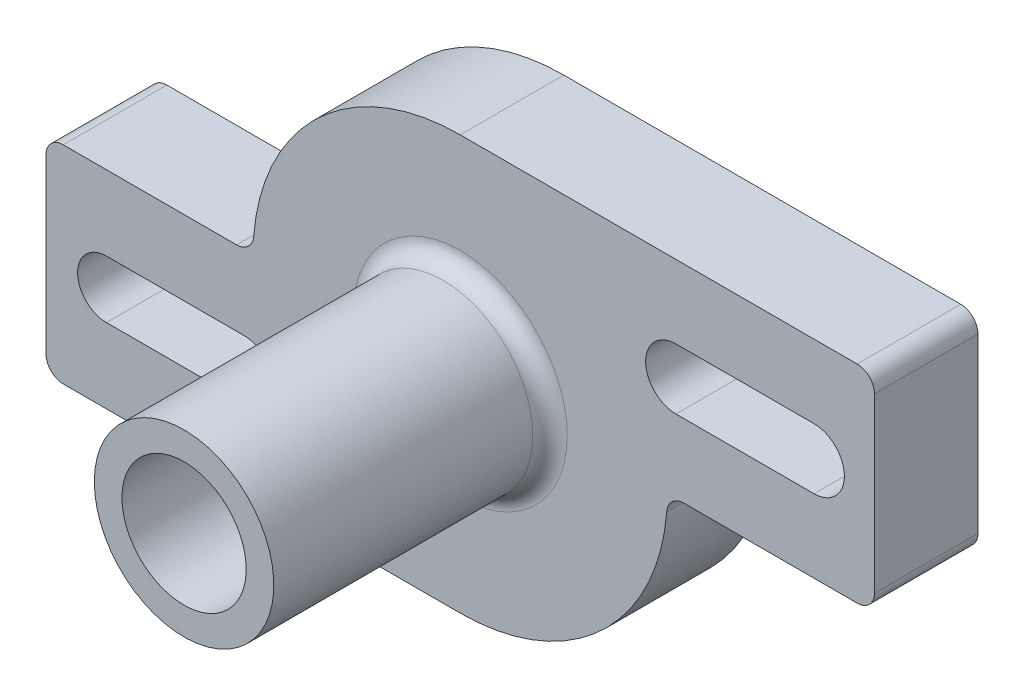
ISO-10303-21;
HEADER;
FILE_DESCRIPTION(('STEP AP214'),'2;1');
FILE_NAME('part.step','',(''),(''),'','','');
FILE_SCHEMA(('AUTOMOTIVE_DESIGN { 1 0 10303 214 1 1 1 1 }'));
ENDSEC;
DATA;
#1=APPLICATION_CONTEXT('core data for automotive mechanical design processes');
#2=APPLICATION_PROTOCOL_DEFINITION('international standard','automotive_design',2000,#1);
#3=PRODUCT_CONTEXT('',#1,'mechanical');
#4=PRODUCT('Part','Part','',(#3));
#5=PRODUCT_RELATED_PRODUCT_CATEGORY('part','',(#4));
#6=PRODUCT_DEFINITION_FORMATION('','',#4);
#7=PRODUCT_DEFINITION_CONTEXT('part definition',#1,'design');
#8=PRODUCT_DEFINITION('design','',#6,#7);
#9=PRODUCT_DEFINITION_SHAPE('','',#8);
#10=(LENGTH_UNIT() NAMED_UNIT(*) SI_UNIT(.MILLI.,.METRE.));
#11=(NAMED_UNIT(*) PLANE_ANGLE_UNIT() SI_UNIT($,.RADIAN.));
#12=(NAMED_UNIT(*) SI_UNIT($,.STERADIAN.) SOLID_ANGLE_UNIT());
#13=UNCERTAINTY_MEASURE_WITH_UNIT(LENGTH_MEASURE(1.E-05),#10,'distance_accuracy_value','');
#14=(GEOMETRIC_REPRESENTATION_CONTEXT(3) GLOBAL_UNCERTAINTY_ASSIGNED_CONTEXT((#13)) GLOBAL_UNIT_ASSIGNED_CONTEXT((#10,
#11,#12)) REPRESENTATION_CONTEXT('',''));
#15=CARTESIAN_POINT('',(0.,0.,0.));
#16=DIRECTION('',(0.,0.,1.));
#17=DIRECTION('',(1.,0.,0.));
#18=AXIS2_PLACEMENT_3D('',#15,#16,#17);
#19=CARTESIAN_POINT('',(-47.7897984071504,88.3956534963122,3.));
#20=DIRECTION('',(0.,0.,1.));
#21=DIRECTION('',(1.,0.,0.));
#22=AXIS2_PLACEMENT_3D('',#19,#20,#21);
#23=PLANE('',#22);
#24=CARTESIAN_POINT('',(-47.7897984071504,88.3956534963122,3.));
#25=DIRECTION('',(0.,0.,1.));
#26=DIRECTION('',(1.,0.,0.));
#27=AXIS2_PLACEMENT_3D('',#24,#25,#26);
#28=CIRCLE('',#27,3.1);
#29=CARTESIAN_POINT('',(-44.6897984071504,88.3956534963122,3.));
#30=VERTEX_POINT('',#29);
#31=EDGE_CURVE('E317',#30,#30,#28,.F.);
#32=ORIENTED_EDGE('',*,*,#31,.T.);
#33=EDGE_LOOP('',(#32));
#34=FACE_BOUND('',#33,.T.);
#35=DIRECTION('',(0.,-1.,0.));
#36=VECTOR('',#35,1.);
#37=CARTESIAN_POINT('',(-59.7897984071504,88.3956534963122,3.));
#38=LINE('',#37,#36);
#39=CARTESIAN_POINT('',(-59.7897984071504,87.8956534963122,3.));
#40=VERTEX_POINT('',#39);
#41=CARTESIAN_POINT('',(-59.7897984071504,82.8956534963122,3.));
#42=VERTEX_POINT('',#41);
#43=EDGE_CURVE('E265',#40,#42,#38,.T.);
#44=ORIENTED_EDGE('',*,*,#43,.T.);
#45=CARTESIAN_POINT('',(-59.2897984071504,82.8956534963122,3.));
#46=DIRECTION('',(0.,0.,1.));
#47=DIRECTION('',(1.,0.,0.));
#48=AXIS2_PLACEMENT_3D('',#45,#46,#47);
#49=CIRCLE('',#48,0.5);
#50=CARTESIAN_POINT('',(-59.2897984071504,82.3956534963122,3.));
#51=VERTEX_POINT('',#50);
#52=EDGE_CURVE('E315',#42,#51,#49,.T.);
#53=ORIENTED_EDGE('',*,*,#52,.T.);
#54=DIRECTION('',(1.,0.,0.));
#55=VECTOR('',#54,1.);
#56=CARTESIAN_POINT('',(-59.7897984071504,82.3956534963122,3.));
#57=LINE('',#56,#55);
#58=CARTESIAN_POINT('',(-47.7897984071504,82.3956534963122,3.));
#59=VERTEX_POINT('',#58);
#60=EDGE_CURVE('E268',#51,#59,#57,.T.);
#61=ORIENTED_EDGE('',*,*,#60,.T.);
#62=CARTESIAN_POINT('',(-47.7897984071504,88.3956534963122,3.));
#63=DIRECTION('',(0.,0.,1.));
#64=DIRECTION('',(1.,0.,0.));
#65=AXIS2_PLACEMENT_3D('',#62,#63,#64);
#66=CIRCLE('',#65,6.);
#67=CARTESIAN_POINT('',(-41.8075762240047,87.9341150347738,3.));
#68=VERTEX_POINT('',#67);
#69=EDGE_CURVE('E270',#59,#68,#66,.T.);
#70=ORIENTED_EDGE('',*,*,#69,.T.);
#71=CARTESIAN_POINT('',(-41.3090577087425,87.8956534963122,3.));
#72=DIRECTION('',(0.,0.,1.));
#73=DIRECTION('',(1.,0.,0.));
#74=AXIS2_PLACEMENT_3D('',#71,#72,#73);
#75=CIRCLE('',#74,0.5);
#76=CARTESIAN_POINT('',(-41.3090577087425,88.3956534963122,3.));
#77=VERTEX_POINT('',#76);
#78=EDGE_CURVE('E11',#68,#77,#75,.F.);
#79=ORIENTED_EDGE('',*,*,#78,.T.);
#80=DIRECTION('',(1.,0.,0.));
#81=VECTOR('',#80,1.);
#82=CARTESIAN_POINT('',(-41.7897984071504,88.3956534963122,3.));
#83=LINE('',#82,#81);
#84=CARTESIAN_POINT('',(-36.2897984071504,88.3956534963122,3.));
#85=VERTEX_POINT('',#84);
#86=EDGE_CURVE('E273',#77,#85,#83,.T.);
#87=ORIENTED_EDGE('',*,*,#86,.T.);
#88=CARTESIAN_POINT('',(-36.2897984071504,88.8956534963122,3.));
#89=DIRECTION('',(0.,0.,1.));
#90=DIRECTION('',(1.,0.,0.));
#91=AXIS2_PLACEMENT_3D('',#88,#89,#90);
#92=CIRCLE('',#91,0.5);
#93=CARTESIAN_POINT('',(-35.7897984071504,88.8956534963122,3.));
#94=VERTEX_POINT('',#93);
#95=EDGE_CURVE('E311',#85,#94,#92,.T.);
#96=ORIENTED_EDGE('',*,*,#95,.T.);
#97=DIRECTION('',(0.,1.,0.));
#98=VECTOR('',#97,1.);
#99=CARTESIAN_POINT('',(-35.7897984071504,94.3956534963122,3.));
#100=LINE('',#99,#98);
#101=CARTESIAN_POINT('',(-35.7897984071504,93.8956534963122,3.));
#102=VERTEX_POINT('',#101);
#103=EDGE_CURVE('E276',#94,#102,#100,.T.);
#104=ORIENTED_EDGE('',*,*,#103,.T.);
#105=CARTESIAN_POINT('',(-36.2897984071504,93.8956534963122,3.));
#106=DIRECTION('',(0.,0.,1.));
#107=DIRECTION('',(1.,0.,0.));
#108=AXIS2_PLACEMENT_3D('',#105,#106,#107);
#109=CIRCLE('',#108,0.5);
#110=CARTESIAN_POINT('',(-36.2897984071504,94.3956534963122,3.));
#111=VERTEX_POINT('',#110);
#112=EDGE_CURVE('E309',#102,#111,#109,.T.);
#113=ORIENTED_EDGE('',*,*,#112,.T.);
#114=DIRECTION('',(-1.,0.,0.));
#115=VECTOR('',#114,1.);
#116=CARTESIAN_POINT('',(-47.7897984071504,94.3956534963122,3.));
#117=LINE('',#116,#115);
#118=CARTESIAN_POINT('',(-47.7897984071504,94.3956534963122,3.));
#119=VERTEX_POINT('',#118);
#120=EDGE_CURVE('E279',#111,#119,#117,.T.);
#121=ORIENTED_EDGE('',*,*,#120,.T.);
#122=CARTESIAN_POINT('',(-47.7897984071504,88.3956534963122,3.));
#123=DIRECTION('',(0.,0.,1.));
#124=DIRECTION('',(1.,0.,0.));
#125=AXIS2_PLACEMENT_3D('',#122,#123,#124);
#126=CIRCLE('',#125,6.);
#127=CARTESIAN_POINT('',(-53.7720205902961,88.8571919578507,3.));
#128=VERTEX_POINT('',#127);
#129=EDGE_CURVE('E258',#119,#128,#126,.T.);
#130=ORIENTED_EDGE('',*,*,#129,.T.);
#131=CARTESIAN_POINT('',(-54.2705391055582,88.8956534963122,3.));
#132=DIRECTION('',(0.,0.,1.));
#133=DIRECTION('',(1.,0.,0.));
#134=AXIS2_PLACEMENT_3D('',#131,#132,#133);
#135=CIRCLE('',#134,0.5);
#136=CARTESIAN_POINT('',(-54.2705391055582,88.3956534963122,3.));
#137=VERTEX_POINT('',#136);
#138=EDGE_CURVE('E357',#128,#137,#135,.F.);
#139=ORIENTED_EDGE('',*,*,#138,.T.);
#140=DIRECTION('',(-1.,0.,0.));
#141=VECTOR('',#140,1.);
#142=CARTESIAN_POINT('',(-53.7897984071504,88.3956534963122,3.));
#143=LINE('',#142,#141);
#144=CARTESIAN_POINT('',(-59.2897984071504,88.3956534963122,3.));
#145=VERTEX_POINT('',#144);
#146=EDGE_CURVE('E261',#137,#145,#143,.T.);
#147=ORIENTED_EDGE('',*,*,#146,.T.);
#148=CARTESIAN_POINT('',(-59.2897984071504,87.8956534963122,3.));
#149=DIRECTION('',(0.,0.,1.));
#150=DIRECTION('',(1.,0.,0.));
#151=AXIS2_PLACEMENT_3D('',#148,#149,#150);
#152=CIRCLE('',#151,0.5);
#153=EDGE_CURVE('E313',#145,#40,#152,.T.);
#154=ORIENTED_EDGE('',*,*,#153,.T.);
#155=EDGE_LOOP('',(#44,#53,#61,#70,#79,#87,#96,#104,#113,#121,#130,#139,#147,#154));
#156=FACE_BOUND('',#155,.T.);
#157=DIRECTION('',(-1.,0.,0.));
#158=VECTOR('',#157,1.);
#159=CARTESIAN_POINT('',(-37.5397984071504,92.2746497934151,3.));
#160=LINE('',#159,#158);
#161=CARTESIAN_POINT('',(-37.5397984071504,92.2746497934151,3.));
#162=VERTEX_POINT('',#161);
#163=CARTESIAN_POINT('',(-41.5397984071504,92.2746497934151,3.));
#164=VERTEX_POINT('',#163);
#165=EDGE_CURVE('E229',#162,#164,#160,.T.);
#166=ORIENTED_EDGE('',*,*,#165,.F.);
#167=CARTESIAN_POINT('',(-37.5397984071504,91.3956534963122,3.));
#168=DIRECTION('',(0.,0.,1.));
#169=DIRECTION('',(1.,0.,0.));
#170=AXIS2_PLACEMENT_3D('',#167,#168,#169);
#171=CIRCLE('',#170,0.878996297102849);
#172=CARTESIAN_POINT('',(-37.5397984071504,90.5166571992094,3.));
#173=VERTEX_POINT('',#172);
#174=EDGE_CURVE('E227',#173,#162,#171,.T.);
#175=ORIENTED_EDGE('',*,*,#174,.F.);
#176=DIRECTION('',(1.,0.,0.));
#177=VECTOR('',#176,1.);
#178=CARTESIAN_POINT('',(-37.5397984071504,90.5166571992094,3.));
#179=LINE('',#178,#177);
#180=CARTESIAN_POINT('',(-41.5397984071504,90.5166571992094,3.));
#181=VERTEX_POINT('',#180);
#182=EDGE_CURVE('E235',#181,#173,#179,.T.);
#183=ORIENTED_EDGE('',*,*,#182,.F.);
#184=CARTESIAN_POINT('',(-41.5397984071504,91.3956534963122,3.));
#185=DIRECTION('',(0.,0.,1.));
#186=DIRECTION('',(1.,0.,0.));
#187=AXIS2_PLACEMENT_3D('',#184,#185,#186);
#188=CIRCLE('',#187,0.878996297102849);
#189=EDGE_CURVE('E232',#164,#181,#188,.T.);
#190=ORIENTED_EDGE('',*,*,#189,.F.);
#191=EDGE_LOOP('',(#166,#175,#183,#190));
#192=FACE_BOUND('',#191,.T.);
#193=DIRECTION('',(1.,0.,0.));
#194=VECTOR('',#193,1.);
#195=CARTESIAN_POINT('',(-58.0397984071504,84.5616142578735,3.));
#196=LINE('',#195,#194);
#197=CARTESIAN_POINT('',(-58.0397984071504,84.5616142578735,3.));
#198=VERTEX_POINT('',#197);
#199=CARTESIAN_POINT('',(-54.0397984071504,84.5616142578735,3.));
#200=VERTEX_POINT('',#199);
#201=EDGE_CURVE('E194',#198,#200,#196,.T.);
#202=ORIENTED_EDGE('',*,*,#201,.F.);
#203=CARTESIAN_POINT('',(-58.0397984071504,85.3956534963122,3.));
#204=DIRECTION('',(0.,0.,1.));
#205=DIRECTION('',(1.,0.,0.));
#206=AXIS2_PLACEMENT_3D('',#203,#204,#205);
#207=CIRCLE('',#206,0.83403923843868);
#208=CARTESIAN_POINT('',(-58.0397984071504,86.2296927347509,3.));
#209=VERTEX_POINT('',#208);
#210=EDGE_CURVE('E184',#209,#198,#207,.T.);
#211=ORIENTED_EDGE('',*,*,#210,.F.);
#212=DIRECTION('',(-1.,0.,0.));
#213=VECTOR('',#212,1.);
#214=CARTESIAN_POINT('',(-58.0397984071504,86.2296927347509,3.));
#215=LINE('',#214,#213);
#216=CARTESIAN_POINT('',(-54.0397984071504,86.2296927347509,3.));
#217=VERTEX_POINT('',#216);
#218=EDGE_CURVE('E209',#217,#209,#215,.T.);
#219=ORIENTED_EDGE('',*,*,#218,.F.);
#220=CARTESIAN_POINT('',(-54.0397984071504,85.3956534963122,3.));
#221=DIRECTION('',(0.,0.,1.));
#222=DIRECTION('',(1.,0.,0.));
#223=AXIS2_PLACEMENT_3D('',#220,#221,#222);
#224=CIRCLE('',#223,0.83403923843868);
#225=EDGE_CURVE('E207',#200,#217,#224,.T.);
#226=ORIENTED_EDGE('',*,*,#225,.F.);
#227=EDGE_LOOP('',(#202,#211,#219,#226));
#228=FACE_BOUND('',#227,.T.);
#229=ADVANCED_FACE('F33',(#34,#156,#192,#228),#23,.T.);
#230=CARTESIAN_POINT('',(-47.7897984071504,88.3956534963122,0.));
#231=DIRECTION('',(0.,0.,1.));
#232=DIRECTION('',(1.,0.,0.));
#233=AXIS2_PLACEMENT_3D('',#230,#231,#232);
#234=PLANE('',#233);
#235=CARTESIAN_POINT('',(-47.7897984071504,88.3956534963122,0.));
#236=DIRECTION('',(0.,0.,-1.));
#237=DIRECTION('',(-1.,0.,0.));
#238=AXIS2_PLACEMENT_3D('',#235,#236,#237);
#239=CIRCLE('',#238,3.25);
#240=CARTESIAN_POINT('',(-51.0397984071504,88.3956534963122,0.));
#241=VERTEX_POINT('',#240);
#242=EDGE_CURVE('E690',#241,#241,#239,.T.);
#243=ORIENTED_EDGE('',*,*,#242,.F.);
#244=EDGE_LOOP('',(#243));
#245=FACE_BOUND('',#244,.T.);
#246=CARTESIAN_POINT('',(-37.5397984071504,91.3956534963122,0.));
#247=DIRECTION('',(0.,0.,1.));
#248=DIRECTION('',(1.,0.,0.));
#249=AXIS2_PLACEMENT_3D('',#246,#247,#248);
#250=CIRCLE('',#249,0.878996297102849);
#251=CARTESIAN_POINT('',(-37.5397984071504,90.5166571992094,0.));
#252=VERTEX_POINT('',#251);
#253=CARTESIAN_POINT('',(-37.5397984071504,92.2746497934151,0.));
#254=VERTEX_POINT('',#253);
#255=EDGE_CURVE('E202',#252,#254,#250,.T.);
#256=ORIENTED_EDGE('',*,*,#255,.T.);
#257=DIRECTION('',(-1.,0.,0.));
#258=VECTOR('',#257,1.);
#259=CARTESIAN_POINT('',(-37.5397984071504,92.2746497934151,0.));
#260=LINE('',#259,#258);
#261=CARTESIAN_POINT('',(-41.5397984071504,92.2746497934151,0.));
#262=VERTEX_POINT('',#261);
#263=EDGE_CURVE('E240',#254,#262,#260,.T.);
#264=ORIENTED_EDGE('',*,*,#263,.T.);
#265=CARTESIAN_POINT('',(-41.5397984071504,91.3956534963122,0.));
#266=DIRECTION('',(0.,0.,1.));
#267=DIRECTION('',(1.,0.,0.));
#268=AXIS2_PLACEMENT_3D('',#265,#266,#267);
#269=CIRCLE('',#268,0.878996297102849);
#270=CARTESIAN_POINT('',(-41.5397984071504,90.5166571992094,0.));
#271=VERTEX_POINT('',#270);
#272=EDGE_CURVE('E243',#262,#271,#269,.T.);
#273=ORIENTED_EDGE('',*,*,#272,.T.);
#274=DIRECTION('',(1.,0.,0.));
#275=VECTOR('',#274,1.);
#276=CARTESIAN_POINT('',(-37.5397984071504,90.5166571992094,0.));
#277=LINE('',#276,#275);
#278=EDGE_CURVE('E230',#271,#252,#277,.T.);
#279=ORIENTED_EDGE('',*,*,#278,.T.);
#280=EDGE_LOOP('',(#256,#264,#273,#279));
#281=FACE_BOUND('',#280,.T.);
#282=DIRECTION('',(1.,0.,0.));
#283=VECTOR('',#282,1.);
#284=CARTESIAN_POINT('',(-59.7897984071504,82.3956534963122,0.));
#285=LINE('',#284,#283);
#286=CARTESIAN_POINT('',(-59.2897984071504,82.3956534963122,0.));
#287=VERTEX_POINT('',#286);
#288=CARTESIAN_POINT('',(-47.7897984071504,82.3956534963122,0.));
#289=VERTEX_POINT('',#288);
#290=EDGE_CURVE('E289',#287,#289,#285,.T.);
#291=ORIENTED_EDGE('',*,*,#290,.F.);
#292=CARTESIAN_POINT('',(-59.2897984071504,82.8956534963122,0.));
#293=DIRECTION('',(0.,0.,1.));
#294=DIRECTION('',(1.,0.,0.));
#295=AXIS2_PLACEMENT_3D('',#292,#293,#294);
#296=CIRCLE('',#295,0.5);
#297=CARTESIAN_POINT('',(-59.7897984071504,82.8956534963122,0.));
#298=VERTEX_POINT('',#297);
#299=EDGE_CURVE('E328',#287,#298,#296,.F.);
#300=ORIENTED_EDGE('',*,*,#299,.T.);
#301=DIRECTION('',(0.,-1.,0.));
#302=VECTOR('',#301,1.);
#303=CARTESIAN_POINT('',(-59.7897984071504,88.3956534963122,0.));
#304=LINE('',#303,#302);
#305=CARTESIAN_POINT('',(-59.7897984071504,87.8956534963122,0.));
#306=VERTEX_POINT('',#305);
#307=EDGE_CURVE('E286',#306,#298,#304,.T.);
#308=ORIENTED_EDGE('',*,*,#307,.F.);
#309=CARTESIAN_POINT('',(-59.2897984071504,87.8956534963122,0.));
#310=DIRECTION('',(0.,0.,1.));
#311=DIRECTION('',(1.,0.,0.));
#312=AXIS2_PLACEMENT_3D('',#309,#310,#311);
#313=CIRCLE('',#312,0.5);
#314=CARTESIAN_POINT('',(-59.2897984071504,88.3956534963122,0.));
#315=VERTEX_POINT('',#314);
#316=EDGE_CURVE('E48',#306,#315,#313,.F.);
#317=ORIENTED_EDGE('',*,*,#316,.T.);
#318=DIRECTION('',(-1.,0.,0.));
#319=VECTOR('',#318,1.);
#320=CARTESIAN_POINT('',(-53.7897984071504,88.3956534963122,0.));
#321=LINE('',#320,#319);
#322=CARTESIAN_POINT('',(-54.2705391055582,88.3956534963122,0.));
#323=VERTEX_POINT('',#322);
#324=EDGE_CURVE('E284',#323,#315,#321,.T.);
#325=ORIENTED_EDGE('',*,*,#324,.F.);
#326=CARTESIAN_POINT('',(-54.2705391055582,88.8956534963122,0.));
#327=DIRECTION('',(0.,0.,1.));
#328=DIRECTION('',(1.,0.,0.));
#329=AXIS2_PLACEMENT_3D('',#326,#327,#328);
#330=CIRCLE('',#329,0.5);
#331=CARTESIAN_POINT('',(-53.7720205902961,88.8571919578507,0.));
#332=VERTEX_POINT('',#331);
#333=EDGE_CURVE('E56',#323,#332,#330,.T.);
#334=ORIENTED_EDGE('',*,*,#333,.T.);
#335=CARTESIAN_POINT('',(-47.7897984071504,88.3956534963122,0.));
#336=DIRECTION('',(0.,0.,1.));
#337=DIRECTION('',(1.,0.,0.));
#338=AXIS2_PLACEMENT_3D('',#335,#336,#337);
#339=CIRCLE('',#338,6.);
#340=CARTESIAN_POINT('',(-47.7897984071504,94.3956534963122,0.));
#341=VERTEX_POINT('',#340);
#342=EDGE_CURVE('E257',#341,#332,#339,.T.);
#343=ORIENTED_EDGE('',*,*,#342,.F.);
#344=DIRECTION('',(-1.,0.,0.));
#345=VECTOR('',#344,1.);
#346=CARTESIAN_POINT('',(-47.7897984071504,94.3956534963122,0.));
#347=LINE('',#346,#345);
#348=CARTESIAN_POINT('',(-36.2897984071504,94.3956534963122,0.));
#349=VERTEX_POINT('',#348);
#350=EDGE_CURVE('E262',#349,#341,#347,.T.);
#351=ORIENTED_EDGE('',*,*,#350,.F.);
#352=CARTESIAN_POINT('',(-36.2897984071504,93.8956534963122,0.));
#353=DIRECTION('',(0.,0.,1.));
#354=DIRECTION('',(1.,0.,0.));
#355=AXIS2_PLACEMENT_3D('',#352,#353,#354);
#356=CIRCLE('',#355,0.5);
#357=CARTESIAN_POINT('',(-35.7897984071504,93.8956534963122,0.));
#358=VERTEX_POINT('',#357);
#359=EDGE_CURVE('E323',#349,#358,#356,.F.);
#360=ORIENTED_EDGE('',*,*,#359,.T.);
#361=DIRECTION('',(0.,1.,0.));
#362=VECTOR('',#361,1.);
#363=CARTESIAN_POINT('',(-35.7897984071504,94.3956534963122,0.));
#364=LINE('',#363,#362);
#365=CARTESIAN_POINT('',(-35.7897984071504,88.8956534963122,0.));
#366=VERTEX_POINT('',#365);
#367=EDGE_CURVE('E297',#366,#358,#364,.T.);
#368=ORIENTED_EDGE('',*,*,#367,.F.);
#369=CARTESIAN_POINT('',(-36.2897984071504,88.8956534963122,0.));
#370=DIRECTION('',(0.,0.,1.));
#371=DIRECTION('',(1.,0.,0.));
#372=AXIS2_PLACEMENT_3D('',#369,#370,#371);
#373=CIRCLE('',#372,0.5);
#374=CARTESIAN_POINT('',(-36.2897984071504,88.3956534963122,0.));
#375=VERTEX_POINT('',#374);
#376=EDGE_CURVE('E325',#366,#375,#373,.F.);
#377=ORIENTED_EDGE('',*,*,#376,.T.);
#378=DIRECTION('',(1.,0.,0.));
#379=VECTOR('',#378,1.);
#380=CARTESIAN_POINT('',(-41.7897984071504,88.3956534963122,0.));
#381=LINE('',#380,#379);
#382=CARTESIAN_POINT('',(-41.3090577087425,88.3956534963122,0.));
#383=VERTEX_POINT('',#382);
#384=EDGE_CURVE('E294',#383,#375,#381,.T.);
#385=ORIENTED_EDGE('',*,*,#384,.F.);
#386=CARTESIAN_POINT('',(-41.3090577087425,87.8956534963122,0.));
#387=DIRECTION('',(0.,0.,1.));
#388=DIRECTION('',(1.,0.,0.));
#389=AXIS2_PLACEMENT_3D('',#386,#387,#388);
#390=CIRCLE('',#389,0.5);
#391=CARTESIAN_POINT('',(-41.8075762240047,87.9341150347738,0.));
#392=VERTEX_POINT('',#391);
#393=EDGE_CURVE('E41',#383,#392,#390,.T.);
#394=ORIENTED_EDGE('',*,*,#393,.T.);
#395=CARTESIAN_POINT('',(-47.7897984071504,88.3956534963122,0.));
#396=DIRECTION('',(0.,0.,1.));
#397=DIRECTION('',(1.,0.,0.));
#398=AXIS2_PLACEMENT_3D('',#395,#396,#397);
#399=CIRCLE('',#398,6.);
#400=EDGE_CURVE('E291',#289,#392,#399,.T.);
#401=ORIENTED_EDGE('',*,*,#400,.F.);
#402=EDGE_LOOP('',(#291,#300,#308,#317,#325,#334,#343,#351,#360,#368,#377,#385,#394,#401));
#403=FACE_BOUND('',#402,.T.);
#404=CARTESIAN_POINT('',(-58.0397984071504,85.3956534963122,0.));
#405=DIRECTION('',(0.,0.,1.));
#406=DIRECTION('',(1.,0.,0.));
#407=AXIS2_PLACEMENT_3D('',#404,#405,#406);
#408=CIRCLE('',#407,0.83403923843868);
#409=CARTESIAN_POINT('',(-58.0397984071504,86.2296927347509,0.));
#410=VERTEX_POINT('',#409);
#411=CARTESIAN_POINT('',(-58.0397984071504,84.5616142578735,0.));
#412=VERTEX_POINT('',#411);
#413=EDGE_CURVE('E214',#410,#412,#408,.T.);
#414=ORIENTED_EDGE('',*,*,#413,.T.);
#415=DIRECTION('',(1.,0.,0.));
#416=VECTOR('',#415,1.);
#417=CARTESIAN_POINT('',(-58.0397984071504,84.5616142578735,0.));
#418=LINE('',#417,#416);
#419=CARTESIAN_POINT('',(-54.0397984071504,84.5616142578735,0.));
#420=VERTEX_POINT('',#419);
#421=EDGE_CURVE('E201',#412,#420,#418,.T.);
#422=ORIENTED_EDGE('',*,*,#421,.T.);
#423=CARTESIAN_POINT('',(-54.0397984071504,85.3956534963122,0.));
#424=DIRECTION('',(0.,0.,1.));
#425=DIRECTION('',(1.,0.,0.));
#426=AXIS2_PLACEMENT_3D('',#423,#424,#425);
#427=CIRCLE('',#426,0.83403923843868);
#428=CARTESIAN_POINT('',(-54.0397984071504,86.2296927347509,0.));
#429=VERTEX_POINT('',#428);
#430=EDGE_CURVE('E218',#420,#429,#427,.T.);
#431=ORIENTED_EDGE('',*,*,#430,.T.);
#432=DIRECTION('',(-1.,0.,0.));
#433=VECTOR('',#432,1.);
#434=CARTESIAN_POINT('',(-58.0397984071504,86.2296927347509,0.));
#435=LINE('',#434,#433);
#436=EDGE_CURVE('E195',#429,#410,#435,.T.);
#437=ORIENTED_EDGE('',*,*,#436,.T.);
#438=EDGE_LOOP('',(#414,#422,#431,#437));
#439=FACE_BOUND('',#438,.T.);
#440=ADVANCED_FACE('F361',(#245,#281,#403,#439),#234,.F.);
#441=CARTESIAN_POINT('',(-47.7897984071504,88.3956534963122,3.));
#442=DIRECTION('',(0.,0.,-1.));
#443=DIRECTION('',(-1.,0.,0.));
#444=AXIS2_PLACEMENT_3D('',#441,#442,#443);
#445=CYLINDRICAL_SURFACE('',#444,6.);
#446=ORIENTED_EDGE('',*,*,#342,.T.);
#447=DIRECTION('',(0.,0.,-1.));
#448=VECTOR('',#447,1.);
#449=CARTESIAN_POINT('',(-53.7720205902961,88.8571919578507,3.));
#450=LINE('',#449,#448);
#451=EDGE_CURVE('E339',#332,#128,#450,.F.);
#452=ORIENTED_EDGE('',*,*,#451,.T.);
#453=ORIENTED_EDGE('',*,*,#129,.F.);
#454=DIRECTION('',(0.,0.,-1.));
#455=VECTOR('',#454,1.);
#456=CARTESIAN_POINT('',(-47.7897984071504,94.3956534963122,3.));
#457=LINE('',#456,#455);
#458=EDGE_CURVE('E281',#119,#341,#457,.T.);
#459=ORIENTED_EDGE('',*,*,#458,.T.);
#460=EDGE_LOOP('',(#446,#452,#453,#459));
#461=FACE_BOUND('',#460,.T.);
#462=ADVANCED_FACE('F398',(#461),#445,.T.);
#463=CARTESIAN_POINT('',(-53.7897984071504,88.3956534963122,3.));
#464=DIRECTION('',(0.,-1.,0.));
#465=DIRECTION('',(0.,0.,-1.));
#466=AXIS2_PLACEMENT_3D('',#463,#464,#465);
#467=PLANE('',#466);
#468=ORIENTED_EDGE('',*,*,#324,.T.);
#469=DIRECTION('',(0.,0.,-1.));
#470=VECTOR('',#469,1.);
#471=CARTESIAN_POINT('',(-59.2897984071504,88.3956534963122,3.));
#472=LINE('',#471,#470);
#473=EDGE_CURVE('E337',#315,#145,#472,.F.);
#474=ORIENTED_EDGE('',*,*,#473,.T.);
#475=ORIENTED_EDGE('',*,*,#146,.F.);
#476=DIRECTION('',(0.,0.,1.));
#477=VECTOR('',#476,1.);
#478=CARTESIAN_POINT('',(-54.2705391055582,88.3956534963122,0.));
#479=LINE('',#478,#477);
#480=EDGE_CURVE('E335',#137,#323,#479,.F.);
#481=ORIENTED_EDGE('',*,*,#480,.T.);
#482=EDGE_LOOP('',(#468,#474,#475,#481));
#483=FACE_BOUND('',#482,.T.);
#484=ADVANCED_FACE('F403',(#483),#467,.F.);
#485=CARTESIAN_POINT('',(-59.7897984071504,88.3956534963122,3.));
#486=DIRECTION('',(1.,0.,0.));
#487=DIRECTION('',(0.,0.,-1.));
#488=AXIS2_PLACEMENT_3D('',#485,#486,#487);
#489=PLANE('',#488);
#490=ORIENTED_EDGE('',*,*,#307,.T.);
#491=DIRECTION('',(0.,0.,-1.));
#492=VECTOR('',#491,1.);
#493=CARTESIAN_POINT('',(-59.7897984071504,82.8956534963122,3.));
#494=LINE('',#493,#492);
#495=EDGE_CURVE('E333',#298,#42,#494,.F.);
#496=ORIENTED_EDGE('',*,*,#495,.T.);
#497=ORIENTED_EDGE('',*,*,#43,.F.);
#498=DIRECTION('',(0.,0.,-1.));
#499=VECTOR('',#498,1.);
#500=CARTESIAN_POINT('',(-59.7897984071504,87.8956534963122,3.));
#501=LINE('',#500,#499);
#502=EDGE_CURVE('E330',#40,#306,#501,.T.);
#503=ORIENTED_EDGE('',*,*,#502,.T.);
#504=EDGE_LOOP('',(#490,#496,#497,#503));
#505=FACE_BOUND('',#504,.T.);
#506=ADVANCED_FACE('F411',(#505),#489,.F.);
#507=CARTESIAN_POINT('',(-59.7897984071504,82.3956534963122,3.));
#508=DIRECTION('',(0.,1.,0.));
#509=DIRECTION('',(0.,0.,1.));
#510=AXIS2_PLACEMENT_3D('',#507,#508,#509);
#511=PLANE('',#510);
#512=ORIENTED_EDGE('',*,*,#60,.F.);
#513=DIRECTION('',(0.,0.,-1.));
#514=VECTOR('',#513,1.);
#515=CARTESIAN_POINT('',(-59.2897984071504,82.3956534963122,3.));
#516=LINE('',#515,#514);
#517=EDGE_CURVE('E320',#51,#287,#516,.T.);
#518=ORIENTED_EDGE('',*,*,#517,.T.);
#519=ORIENTED_EDGE('',*,*,#290,.T.);
#520=DIRECTION('',(0.,0.,-1.));
#521=VECTOR('',#520,1.);
#522=CARTESIAN_POINT('',(-47.7897984071504,82.3956534963122,3.));
#523=LINE('',#522,#521);
#524=EDGE_CURVE('E303',#59,#289,#523,.T.);
#525=ORIENTED_EDGE('',*,*,#524,.F.);
#526=EDGE_LOOP('',(#512,#518,#519,#525));
#527=FACE_BOUND('',#526,.T.);
#528=ADVANCED_FACE('F419',(#527),#511,.F.);
#529=CARTESIAN_POINT('',(-47.7897984071504,88.3956534963122,3.));
#530=DIRECTION('',(0.,0.,-1.));
#531=DIRECTION('',(-1.,0.,0.));
#532=AXIS2_PLACEMENT_3D('',#529,#530,#531);
#533=CYLINDRICAL_SURFACE('',#532,6.);
#534=ORIENTED_EDGE('',*,*,#400,.T.);
#535=DIRECTION('',(0.,0.,-1.));
#536=VECTOR('',#535,1.);
#537=CARTESIAN_POINT('',(-41.8075762240047,87.9341150347738,3.));
#538=LINE('',#537,#536);
#539=EDGE_CURVE('E346',#392,#68,#538,.F.);
#540=ORIENTED_EDGE('',*,*,#539,.T.);
#541=ORIENTED_EDGE('',*,*,#69,.F.);
#542=ORIENTED_EDGE('',*,*,#524,.T.);
#543=EDGE_LOOP('',(#534,#540,#541,#542));
#544=FACE_BOUND('',#543,.T.);
#545=ADVANCED_FACE('F367',(#544),#533,.T.);
#546=CARTESIAN_POINT('',(-41.7897984071504,88.3956534963122,3.));
#547=DIRECTION('',(0.,1.,0.));
#548=DIRECTION('',(0.,0.,1.));
#549=AXIS2_PLACEMENT_3D('',#546,#547,#548);
#550=PLANE('',#549);
#551=ORIENTED_EDGE('',*,*,#86,.F.);
#552=DIRECTION('',(0.,0.,1.));
#553=VECTOR('',#552,1.);
#554=CARTESIAN_POINT('',(-41.3090577087425,88.3956534963122,0.));
#555=LINE('',#554,#553);
#556=EDGE_CURVE('E343',#77,#383,#555,.F.);
#557=ORIENTED_EDGE('',*,*,#556,.T.);
#558=ORIENTED_EDGE('',*,*,#384,.T.);
#559=DIRECTION('',(0.,0.,-1.));
#560=VECTOR('',#559,1.);
#561=CARTESIAN_POINT('',(-36.2897984071504,88.3956534963122,3.));
#562=LINE('',#561,#560);
#563=EDGE_CURVE('E341',#375,#85,#562,.F.);
#564=ORIENTED_EDGE('',*,*,#563,.T.);
#565=EDGE_LOOP('',(#551,#557,#558,#564));
#566=FACE_BOUND('',#565,.T.);
#567=ADVANCED_FACE('F377',(#566),#550,.F.);
#568=CARTESIAN_POINT('',(-35.7897984071504,94.3956534963122,3.));
#569=DIRECTION('',(-1.,0.,0.));
#570=DIRECTION('',(0.,-1.,0.));
#571=AXIS2_PLACEMENT_3D('',#568,#569,#570);
#572=PLANE('',#571);
#573=ORIENTED_EDGE('',*,*,#103,.F.);
#574=DIRECTION('',(0.,0.,-1.));
#575=VECTOR('',#574,1.);
#576=CARTESIAN_POINT('',(-35.7897984071504,88.8956534963122,3.));
#577=LINE('',#576,#575);
#578=EDGE_CURVE('E350',#94,#366,#577,.T.);
#579=ORIENTED_EDGE('',*,*,#578,.T.);
#580=ORIENTED_EDGE('',*,*,#367,.T.);
#581=DIRECTION('',(0.,0.,-1.));
#582=VECTOR('',#581,1.);
#583=CARTESIAN_POINT('',(-35.7897984071504,93.8956534963122,3.));
#584=LINE('',#583,#582);
#585=EDGE_CURVE('E348',#358,#102,#584,.F.);
#586=ORIENTED_EDGE('',*,*,#585,.T.);
#587=EDGE_LOOP('',(#573,#579,#580,#586));
#588=FACE_BOUND('',#587,.T.);
#589=ADVANCED_FACE('F385',(#588),#572,.F.);
#590=CARTESIAN_POINT('',(-47.7897984071504,94.3956534963122,3.));
#591=DIRECTION('',(0.,-1.,0.));
#592=DIRECTION('',(0.,0.,-1.));
#593=AXIS2_PLACEMENT_3D('',#590,#591,#592);
#594=PLANE('',#593);
#595=ORIENTED_EDGE('',*,*,#120,.F.);
#596=DIRECTION('',(0.,0.,-1.));
#597=VECTOR('',#596,1.);
#598=CARTESIAN_POINT('',(-36.2897984071504,94.3956534963122,3.));
#599=LINE('',#598,#597);
#600=EDGE_CURVE('E353',#111,#349,#599,.T.);
#601=ORIENTED_EDGE('',*,*,#600,.T.);
#602=ORIENTED_EDGE('',*,*,#350,.T.);
#603=ORIENTED_EDGE('',*,*,#458,.F.);
#604=EDGE_LOOP('',(#595,#601,#602,#603));
#605=FACE_BOUND('',#604,.T.);
#606=ADVANCED_FACE('F393',(#605),#594,.F.);
#607=CARTESIAN_POINT('',(-37.5397984071504,91.3956534963122,3.));
#608=DIRECTION('',(0.,0.,-1.));
#609=DIRECTION('',(-1.,0.,0.));
#610=AXIS2_PLACEMENT_3D('',#607,#608,#609);
#611=CYLINDRICAL_SURFACE('',#610,0.878996297102849);
#612=ORIENTED_EDGE('',*,*,#255,.F.);
#613=DIRECTION('',(0.,0.,-1.));
#614=VECTOR('',#613,1.);
#615=CARTESIAN_POINT('',(-37.5397984071504,90.5166571992094,3.));
#616=LINE('',#615,#614);
#617=EDGE_CURVE('E237',#173,#252,#616,.T.);
#618=ORIENTED_EDGE('',*,*,#617,.F.);
#619=ORIENTED_EDGE('',*,*,#174,.T.);
#620=DIRECTION('',(0.,0.,-1.));
#621=VECTOR('',#620,1.);
#622=CARTESIAN_POINT('',(-37.5397984071504,92.2746497934151,3.));
#623=LINE('',#622,#621);
#624=EDGE_CURVE('E254',#162,#254,#623,.T.);
#625=ORIENTED_EDGE('',*,*,#624,.T.);
#626=EDGE_LOOP('',(#612,#618,#619,#625));
#627=FACE_BOUND('',#626,.T.);
#628=ADVANCED_FACE('F437',(#627),#611,.F.);
#629=CARTESIAN_POINT('',(-37.5397984071504,92.2746497934151,3.));
#630=DIRECTION('',(0.,-1.,0.));
#631=DIRECTION('',(0.,0.,-1.));
#632=AXIS2_PLACEMENT_3D('',#629,#630,#631);
#633=PLANE('',#632);
#634=ORIENTED_EDGE('',*,*,#263,.F.);
#635=ORIENTED_EDGE('',*,*,#624,.F.);
#636=ORIENTED_EDGE('',*,*,#165,.T.);
#637=DIRECTION('',(0.,0.,-1.));
#638=VECTOR('',#637,1.);
#639=CARTESIAN_POINT('',(-41.5397984071504,92.2746497934151,3.));
#640=LINE('',#639,#638);
#641=EDGE_CURVE('E252',#164,#262,#640,.T.);
#642=ORIENTED_EDGE('',*,*,#641,.T.);
#643=EDGE_LOOP('',(#634,#635,#636,#642));
#644=FACE_BOUND('',#643,.T.);
#645=ADVANCED_FACE('F464',(#644),#633,.T.);
#646=CARTESIAN_POINT('',(-41.5397984071504,91.3956534963122,3.));
#647=DIRECTION('',(0.,0.,-1.));
#648=DIRECTION('',(-1.,0.,0.));
#649=AXIS2_PLACEMENT_3D('',#646,#647,#648);
#650=CYLINDRICAL_SURFACE('',#649,0.878996297102849);
#651=ORIENTED_EDGE('',*,*,#272,.F.);
#652=ORIENTED_EDGE('',*,*,#641,.F.);
#653=ORIENTED_EDGE('',*,*,#189,.T.);
#654=DIRECTION('',(0.,0.,-1.));
#655=VECTOR('',#654,1.);
#656=CARTESIAN_POINT('',(-41.5397984071504,90.5166571992094,3.));
#657=LINE('',#656,#655);
#658=EDGE_CURVE('E250',#181,#271,#657,.T.);
#659=ORIENTED_EDGE('',*,*,#658,.T.);
#660=EDGE_LOOP('',(#651,#652,#653,#659));
#661=FACE_BOUND('',#660,.T.);
#662=ADVANCED_FACE('F471',(#661),#650,.F.);
#663=CARTESIAN_POINT('',(-37.5397984071504,90.5166571992094,3.));
#664=DIRECTION('',(0.,1.,0.));
#665=DIRECTION('',(0.,0.,1.));
#666=AXIS2_PLACEMENT_3D('',#663,#664,#665);
#667=PLANE('',#666);
#668=ORIENTED_EDGE('',*,*,#278,.F.);
#669=ORIENTED_EDGE('',*,*,#658,.F.);
#670=ORIENTED_EDGE('',*,*,#182,.T.);
#671=ORIENTED_EDGE('',*,*,#617,.T.);
#672=EDGE_LOOP('',(#668,#669,#670,#671));
#673=FACE_BOUND('',#672,.T.);
#674=ADVANCED_FACE('F478',(#673),#667,.T.);
#675=CARTESIAN_POINT('',(-58.0397984071504,85.3956534963122,3.));
#676=DIRECTION('',(0.,0.,-1.));
#677=DIRECTION('',(-1.,0.,0.));
#678=AXIS2_PLACEMENT_3D('',#675,#676,#677);
#679=CYLINDRICAL_SURFACE('',#678,0.83403923843868);
#680=ORIENTED_EDGE('',*,*,#413,.F.);
#681=DIRECTION('',(0.,0.,-1.));
#682=VECTOR('',#681,1.);
#683=CARTESIAN_POINT('',(-58.0397984071504,86.2296927347509,3.));
#684=LINE('',#683,#682);
#685=EDGE_CURVE('E190',#209,#410,#684,.T.);
#686=ORIENTED_EDGE('',*,*,#685,.F.);
#687=ORIENTED_EDGE('',*,*,#210,.T.);
#688=DIRECTION('',(0.,0.,-1.));
#689=VECTOR('',#688,1.);
#690=CARTESIAN_POINT('',(-58.0397984071504,84.5616142578735,3.));
#691=LINE('',#690,#689);
#692=EDGE_CURVE('E187',#198,#412,#691,.T.);
#693=ORIENTED_EDGE('',*,*,#692,.T.);
#694=EDGE_LOOP('',(#680,#686,#687,#693));
#695=FACE_BOUND('',#694,.T.);
#696=ADVANCED_FACE('F186',(#695),#679,.F.);
#697=CARTESIAN_POINT('',(-58.0397984071504,84.5616142578735,3.));
#698=DIRECTION('',(0.,1.,0.));
#699=DIRECTION('',(0.,0.,1.));
#700=AXIS2_PLACEMENT_3D('',#697,#698,#699);
#701=PLANE('',#700);
#702=ORIENTED_EDGE('',*,*,#421,.F.);
#703=ORIENTED_EDGE('',*,*,#692,.F.);
#704=ORIENTED_EDGE('',*,*,#201,.T.);
#705=DIRECTION('',(0.,0.,-1.));
#706=VECTOR('',#705,1.);
#707=CARTESIAN_POINT('',(-54.0397984071504,84.5616142578735,3.));
#708=LINE('',#707,#706);
#709=EDGE_CURVE('E203',#200,#420,#708,.T.);
#710=ORIENTED_EDGE('',*,*,#709,.T.);
#711=EDGE_LOOP('',(#702,#703,#704,#710));
#712=FACE_BOUND('',#711,.T.);
#713=ADVANCED_FACE('F198',(#712),#701,.T.);
#714=CARTESIAN_POINT('',(-54.0397984071504,85.3956534963122,3.));
#715=DIRECTION('',(0.,0.,-1.));
#716=DIRECTION('',(-1.,0.,0.));
#717=AXIS2_PLACEMENT_3D('',#714,#715,#716);
#718=CYLINDRICAL_SURFACE('',#717,0.83403923843868);
#719=ORIENTED_EDGE('',*,*,#430,.F.);
#720=ORIENTED_EDGE('',*,*,#709,.F.);
#721=ORIENTED_EDGE('',*,*,#225,.T.);
#722=DIRECTION('',(0.,0.,-1.));
#723=VECTOR('',#722,1.);
#724=CARTESIAN_POINT('',(-54.0397984071504,86.2296927347509,3.));
#725=LINE('',#724,#723);
#726=EDGE_CURVE('E224',#217,#429,#725,.T.);
#727=ORIENTED_EDGE('',*,*,#726,.T.);
#728=EDGE_LOOP('',(#719,#720,#721,#727));
#729=FACE_BOUND('',#728,.T.);
#730=ADVANCED_FACE('F499',(#729),#718,.F.);
#731=CARTESIAN_POINT('',(-58.0397984071504,86.2296927347509,3.));
#732=DIRECTION('',(0.,-1.,0.));
#733=DIRECTION('',(0.,0.,-1.));
#734=AXIS2_PLACEMENT_3D('',#731,#732,#733);
#735=PLANE('',#734);
#736=ORIENTED_EDGE('',*,*,#436,.F.);
#737=ORIENTED_EDGE('',*,*,#726,.F.);
#738=ORIENTED_EDGE('',*,*,#218,.T.);
#739=ORIENTED_EDGE('',*,*,#685,.T.);
#740=EDGE_LOOP('',(#736,#737,#738,#739));
#741=FACE_BOUND('',#740,.T.);
#742=ADVANCED_FACE('F506',(#741),#735,.T.);
#743=CARTESIAN_POINT('',(-47.7897984071504,88.3956534963122,11.));
#744=DIRECTION('',(0.,0.,-1.));
#745=DIRECTION('',(-1.,0.,0.));
#746=AXIS2_PLACEMENT_3D('',#743,#744,#745);
#747=CYLINDRICAL_SURFACE('',#746,2.6);
#748=CARTESIAN_POINT('',(-47.7897984071504,88.3956534963122,3.5));
#749=DIRECTION('',(0.,0.,1.));
#750=DIRECTION('',(1.,0.,0.));
#751=AXIS2_PLACEMENT_3D('',#748,#749,#750);
#752=CIRCLE('',#751,2.6);
#753=CARTESIAN_POINT('',(-45.1897984071504,88.3956534963122,3.5));
#754=VERTEX_POINT('',#753);
#755=EDGE_CURVE('E306',#754,#754,#752,.T.);
#756=ORIENTED_EDGE('',*,*,#755,.T.);
#757=EDGE_LOOP('',(#756));
#758=FACE_BOUND('',#757,.T.);
#759=CARTESIAN_POINT('',(-47.7897984071504,88.3956534963122,11.));
#760=DIRECTION('',(0.,0.,-1.));
#761=DIRECTION('',(-1.,0.,0.));
#762=AXIS2_PLACEMENT_3D('',#759,#760,#761);
#763=CIRCLE('',#762,2.6);
#764=CARTESIAN_POINT('',(-50.3897984071504,88.3956534963122,11.));
#765=VERTEX_POINT('',#764);
#766=EDGE_CURVE('E216',#765,#765,#763,.T.);
#767=ORIENTED_EDGE('',*,*,#766,.T.);
#768=EDGE_LOOP('',(#767));
#769=FACE_BOUND('',#768,.T.);
#770=ADVANCED_FACE('F514',(#758,#769),#747,.T.);
#771=CARTESIAN_POINT('',(-47.7897984071504,88.3956534963122,11.));
#772=DIRECTION('',(0.,0.,-1.));
#773=DIRECTION('',(-1.,0.,0.));
#774=AXIS2_PLACEMENT_3D('',#771,#772,#773);
#775=PLANE('',#774);
#776=CARTESIAN_POINT('',(-47.7897984071504,88.3956534963122,11.));
#777=DIRECTION('',(0.,0.,-1.));
#778=DIRECTION('',(-1.,0.,0.));
#779=AXIS2_PLACEMENT_3D('',#776,#777,#778);
#780=CIRCLE('',#779,1.8);
#781=CARTESIAN_POINT('',(-49.5897984071504,88.3956534963122,11.));
#782=VERTEX_POINT('',#781);
#783=EDGE_CURVE('E697',#782,#782,#780,.T.);
#784=ORIENTED_EDGE('',*,*,#783,.T.);
#785=EDGE_LOOP('',(#784));
#786=FACE_BOUND('',#785,.T.);
#787=ORIENTED_EDGE('',*,*,#766,.F.);
#788=EDGE_LOOP('',(#787));
#789=FACE_BOUND('',#788,.T.);
#790=ADVANCED_FACE('F521',(#786,#789),#775,.F.);
#791=CARTESIAN_POINT('',(-47.7897984071504,88.3956534963122,3.5));
#792=DIRECTION('',(0.,0.,1.));
#793=DIRECTION('',(1.,0.,0.));
#794=AXIS2_PLACEMENT_3D('',#791,#792,#793);
#795=TOROIDAL_SURFACE('',#794,3.1,0.5);
#796=ORIENTED_EDGE('',*,*,#31,.F.);
#797=EDGE_LOOP('',(#796));
#798=FACE_BOUND('',#797,.T.);
#799=ORIENTED_EDGE('',*,*,#755,.F.);
#800=EDGE_LOOP('',(#799));
#801=FACE_BOUND('',#800,.T.);
#802=ADVANCED_FACE('F530',(#798,#801),#795,.F.);
#803=CARTESIAN_POINT('',(-59.2897984071504,82.8956534963122,3.));
#804=DIRECTION('',(0.,0.,-1.));
#805=DIRECTION('',(-1.,0.,0.));
#806=AXIS2_PLACEMENT_3D('',#803,#804,#805);
#807=CYLINDRICAL_SURFACE('',#806,0.5);
#808=ORIENTED_EDGE('',*,*,#52,.F.);
#809=ORIENTED_EDGE('',*,*,#495,.F.);
#810=ORIENTED_EDGE('',*,*,#299,.F.);
#811=ORIENTED_EDGE('',*,*,#517,.F.);
#812=EDGE_LOOP('',(#808,#809,#810,#811));
#813=FACE_BOUND('',#812,.T.);
#814=ADVANCED_FACE('F416',(#813),#807,.T.);
#815=CARTESIAN_POINT('',(-59.2897984071504,87.8956534963122,3.));
#816=DIRECTION('',(0.,0.,-1.));
#817=DIRECTION('',(-1.,0.,0.));
#818=AXIS2_PLACEMENT_3D('',#815,#816,#817);
#819=CYLINDRICAL_SURFACE('',#818,0.5);
#820=ORIENTED_EDGE('',*,*,#153,.F.);
#821=ORIENTED_EDGE('',*,*,#473,.F.);
#822=ORIENTED_EDGE('',*,*,#316,.F.);
#823=ORIENTED_EDGE('',*,*,#502,.F.);
#824=EDGE_LOOP('',(#820,#821,#822,#823));
#825=FACE_BOUND('',#824,.T.);
#826=ADVANCED_FACE('F409',(#825),#819,.T.);
#827=CARTESIAN_POINT('',(-54.2705391055582,88.8956534963122,3.));
#828=DIRECTION('',(0.,0.,-1.));
#829=DIRECTION('',(-1.,0.,0.));
#830=AXIS2_PLACEMENT_3D('',#827,#828,#829);
#831=CYLINDRICAL_SURFACE('',#830,0.5);
#832=ORIENTED_EDGE('',*,*,#138,.F.);
#833=ORIENTED_EDGE('',*,*,#451,.F.);
#834=ORIENTED_EDGE('',*,*,#333,.F.);
#835=ORIENTED_EDGE('',*,*,#480,.F.);
#836=EDGE_LOOP('',(#832,#833,#834,#835));
#837=FACE_BOUND('',#836,.T.);
#838=ADVANCED_FACE('F401',(#837),#831,.F.);
#839=CARTESIAN_POINT('',(-41.3090577087425,87.8956534963122,3.));
#840=DIRECTION('',(0.,0.,-1.));
#841=DIRECTION('',(-1.,0.,0.));
#842=AXIS2_PLACEMENT_3D('',#839,#840,#841);
#843=CYLINDRICAL_SURFACE('',#842,0.5);
#844=ORIENTED_EDGE('',*,*,#78,.F.);
#845=ORIENTED_EDGE('',*,*,#539,.F.);
#846=ORIENTED_EDGE('',*,*,#393,.F.);
#847=ORIENTED_EDGE('',*,*,#556,.F.);
#848=EDGE_LOOP('',(#844,#845,#846,#847));
#849=FACE_BOUND('',#848,.T.);
#850=ADVANCED_FACE('F371',(#849),#843,.F.);
#851=CARTESIAN_POINT('',(-36.2897984071504,88.8956534963122,3.));
#852=DIRECTION('',(0.,0.,-1.));
#853=DIRECTION('',(-1.,0.,0.));
#854=AXIS2_PLACEMENT_3D('',#851,#852,#853);
#855=CYLINDRICAL_SURFACE('',#854,0.5);
#856=ORIENTED_EDGE('',*,*,#95,.F.);
#857=ORIENTED_EDGE('',*,*,#563,.F.);
#858=ORIENTED_EDGE('',*,*,#376,.F.);
#859=ORIENTED_EDGE('',*,*,#578,.F.);
#860=EDGE_LOOP('',(#856,#857,#858,#859));
#861=FACE_BOUND('',#860,.T.);
#862=ADVANCED_FACE('F380',(#861),#855,.T.);
#863=CARTESIAN_POINT('',(-36.2897984071504,93.8956534963122,3.));
#864=DIRECTION('',(0.,0.,-1.));
#865=DIRECTION('',(-1.,0.,0.));
#866=AXIS2_PLACEMENT_3D('',#863,#864,#865);
#867=CYLINDRICAL_SURFACE('',#866,0.5);
#868=ORIENTED_EDGE('',*,*,#112,.F.);
#869=ORIENTED_EDGE('',*,*,#585,.F.);
#870=ORIENTED_EDGE('',*,*,#359,.F.);
#871=ORIENTED_EDGE('',*,*,#600,.F.);
#872=EDGE_LOOP('',(#868,#869,#870,#871));
#873=FACE_BOUND('',#872,.T.);
#874=ADVANCED_FACE('F35',(#873),#867,.T.);
#875=CARTESIAN_POINT('',(-47.7897984071504,88.3956534963122,0.));
#876=DIRECTION('',(0.,0.,-1.));
#877=DIRECTION('',(-1.,0.,0.));
#878=AXIS2_PLACEMENT_3D('',#875,#876,#877);
#879=CYLINDRICAL_SURFACE('',#878,1.8);
#880=ORIENTED_EDGE('',*,*,#783,.F.);
#881=EDGE_LOOP('',(#880));
#882=FACE_BOUND('',#881,.T.);
#883=CARTESIAN_POINT('',(-47.7897984071504,88.3956534963122,2.4));
#884=DIRECTION('',(0.,0.,-1.));
#885=DIRECTION('',(-1.,0.,0.));
#886=AXIS2_PLACEMENT_3D('',#883,#884,#885);
#887=CIRCLE('',#886,1.8);
#888=CARTESIAN_POINT('',(-49.5897984071504,88.3956534963122,2.4));
#889=VERTEX_POINT('',#888);
#890=EDGE_CURVE('E692',#889,#889,#887,.T.);
#891=ORIENTED_EDGE('',*,*,#890,.T.);
#892=EDGE_LOOP('',(#891));
#893=FACE_BOUND('',#892,.T.);
#894=ADVANCED_FACE('F575',(#882,#893),#879,.F.);
#895=CARTESIAN_POINT('',(-45.9897984071504,88.3956534963122,2.4));
#896=DIRECTION('',(0.,0.,1.));
#897=DIRECTION('',(1.,0.,0.));
#898=AXIS2_PLACEMENT_3D('',#895,#896,#897);
#899=PLANE('',#898);
#900=ORIENTED_EDGE('',*,*,#890,.F.);
#901=EDGE_LOOP('',(#900));
#902=FACE_BOUND('',#901,.T.);
#903=CARTESIAN_POINT('',(-47.7897984071504,88.3956534963122,2.4));
#904=DIRECTION('',(0.,0.,-1.));
#905=DIRECTION('',(-1.,0.,0.));
#906=AXIS2_PLACEMENT_3D('',#903,#904,#905);
#907=CIRCLE('',#906,3.25);
#908=CARTESIAN_POINT('',(-51.0397984071504,88.3956534963122,2.4));
#909=VERTEX_POINT('',#908);
#910=EDGE_CURVE('E687',#909,#909,#907,.T.);
#911=ORIENTED_EDGE('',*,*,#910,.T.);
#912=EDGE_LOOP('',(#911));
#913=FACE_BOUND('',#912,.T.);
#914=ADVANCED_FACE('F580',(#902,#913),#899,.F.);
#915=CARTESIAN_POINT('',(-47.7897984071504,88.3956534963122,0.));
#916=DIRECTION('',(0.,0.,-1.));
#917=DIRECTION('',(-1.,0.,0.));
#918=AXIS2_PLACEMENT_3D('',#915,#916,#917);
#919=CYLINDRICAL_SURFACE('',#918,3.25);
#920=ORIENTED_EDGE('',*,*,#910,.F.);
#921=EDGE_LOOP('',(#920));
#922=FACE_BOUND('',#921,.T.);
#923=ORIENTED_EDGE('',*,*,#242,.T.);
#924=EDGE_LOOP('',(#923));
#925=FACE_BOUND('',#924,.T.);
#926=ADVANCED_FACE('F588',(#922,#925),#919,.F.);
#927=CLOSED_SHELL('',(#229,#440,#462,#484,#506,#528,#545,#567,#589,#606,#628,#645,#662,#674,
#696,#713,#730,#742,#770,#790,#802,#814,#826,#838,#850,#862,#874,#894,#914,#926));
#928=MANIFOLD_SOLID_BREP('B2',#927);
#929=ADVANCED_BREP_SHAPE_REPRESENTATION('',(#18,#928),#14);
#930=SHAPE_DEFINITION_REPRESENTATION(#9,#929);
ENDSEC;
END-ISO-10303-21;
